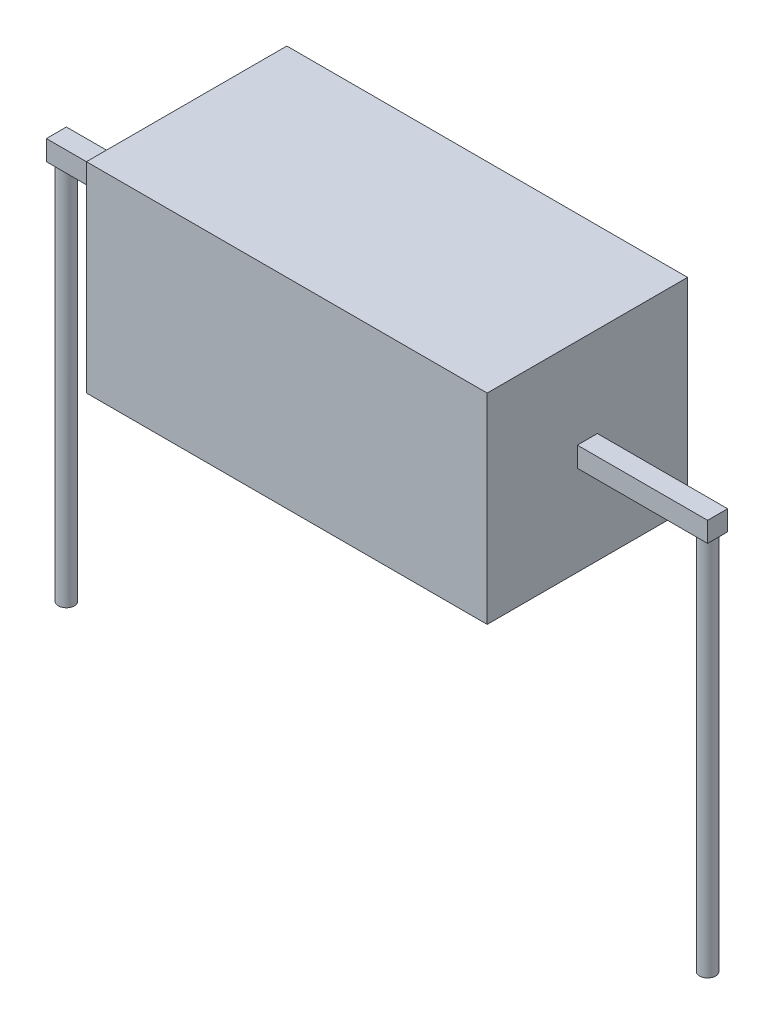
ISO-10303-21;
HEADER;
FILE_DESCRIPTION(('STEP AP214'),'2;1');
FILE_NAME('part.step','',(''),(''),'','','');
FILE_SCHEMA(('AUTOMOTIVE_DESIGN { 1 0 10303 214 1 1 1 1 }'));
ENDSEC;
DATA;
#1=APPLICATION_CONTEXT('core data for automotive mechanical design processes');
#2=APPLICATION_PROTOCOL_DEFINITION('international standard','automotive_design',2000,#1);
#3=PRODUCT_CONTEXT('',#1,'mechanical');
#4=PRODUCT('Part','Part','',(#3));
#5=PRODUCT_RELATED_PRODUCT_CATEGORY('part','',(#4));
#6=PRODUCT_DEFINITION_FORMATION('','',#4);
#7=PRODUCT_DEFINITION_CONTEXT('part definition',#1,'design');
#8=PRODUCT_DEFINITION('design','',#6,#7);
#9=PRODUCT_DEFINITION_SHAPE('','',#8);
#10=(LENGTH_UNIT() NAMED_UNIT(*) SI_UNIT(.MILLI.,.METRE.));
#11=(NAMED_UNIT(*) PLANE_ANGLE_UNIT() SI_UNIT($,.RADIAN.));
#12=(NAMED_UNIT(*) SI_UNIT($,.STERADIAN.) SOLID_ANGLE_UNIT());
#13=UNCERTAINTY_MEASURE_WITH_UNIT(LENGTH_MEASURE(1.E-05),#10,'distance_accuracy_value','');
#14=(GEOMETRIC_REPRESENTATION_CONTEXT(3) GLOBAL_UNCERTAINTY_ASSIGNED_CONTEXT((#13)) GLOBAL_UNIT_ASSIGNED_CONTEXT((#10,
#11,#12)) REPRESENTATION_CONTEXT('',''));
#15=CARTESIAN_POINT('',(0.,0.,0.));
#16=DIRECTION('',(0.,0.,1.));
#17=DIRECTION('',(1.,0.,0.));
#18=AXIS2_PLACEMENT_3D('',#15,#16,#17);
#19=CARTESIAN_POINT('',(26.5,4.5,5.5));
#20=DIRECTION('',(0.,1.,0.));
#21=DIRECTION('',(0.,0.,1.));
#22=AXIS2_PLACEMENT_3D('',#19,#20,#21);
#23=PLANE('',#22);
#24=DIRECTION('',(-1.,0.,0.));
#25=VECTOR('',#24,1.);
#26=CARTESIAN_POINT('',(26.5,4.5,5.5));
#27=LINE('',#26,#25);
#28=CARTESIAN_POINT('',(26.5,4.5,5.5));
#29=VERTEX_POINT('',#28);
#30=CARTESIAN_POINT('',(20.,4.5,5.5));
#31=VERTEX_POINT('',#30);
#32=EDGE_CURVE('E126',#29,#31,#27,.T.);
#33=ORIENTED_EDGE('',*,*,#32,.T.);
#34=DIRECTION('',(0.,0.,-1.));
#35=VECTOR('',#34,1.);
#36=CARTESIAN_POINT('',(20.,4.5,10.));
#37=LINE('',#36,#35);
#38=CARTESIAN_POINT('',(20.,4.5,4.5));
#39=VERTEX_POINT('',#38);
#40=EDGE_CURVE('E215',#31,#39,#37,.T.);
#41=ORIENTED_EDGE('',*,*,#40,.T.);
#42=DIRECTION('',(-1.,0.,0.));
#43=VECTOR('',#42,1.);
#44=CARTESIAN_POINT('',(26.5,4.5,4.5));
#45=LINE('',#44,#43);
#46=CARTESIAN_POINT('',(26.5,4.5,4.5));
#47=VERTEX_POINT('',#46);
#48=EDGE_CURVE('E127',#47,#39,#45,.T.);
#49=ORIENTED_EDGE('',*,*,#48,.F.);
#50=DIRECTION('',(0.,0.,-1.));
#51=VECTOR('',#50,1.);
#52=CARTESIAN_POINT('',(26.5,4.5,5.5));
#53=LINE('',#52,#51);
#54=EDGE_CURVE('E155',#29,#47,#53,.T.);
#55=ORIENTED_EDGE('',*,*,#54,.F.);
#56=EDGE_LOOP('',(#33,#41,#49,#55));
#57=FACE_BOUND('',#56,.T.);
#58=CARTESIAN_POINT('',(26.,4.5,5.));
#59=DIRECTION('',(0.,1.,0.));
#60=DIRECTION('',(0.,0.,1.));
#61=AXIS2_PLACEMENT_3D('',#58,#59,#60);
#62=CIRCLE('',#61,0.400000000000001);
#63=CARTESIAN_POINT('',(26.,4.5,5.40000000000001));
#64=VERTEX_POINT('',#63);
#65=EDGE_CURVE('E11',#64,#64,#62,.F.);
#66=ORIENTED_EDGE('',*,*,#65,.F.);
#67=EDGE_LOOP('',(#66));
#68=FACE_BOUND('',#67,.T.);
#69=ADVANCED_FACE('F31',(#57,#68),#23,.F.);
#70=CARTESIAN_POINT('',(0.,4.5,4.5));
#71=VERTEX_POINT('',#70);
#72=CARTESIAN_POINT('',(-6.5,4.5,4.5));
#73=VERTEX_POINT('',#72);
#74=EDGE_CURVE('E168',#71,#73,#45,.T.);
#75=ORIENTED_EDGE('',*,*,#74,.F.);
#76=DIRECTION('',(0.,0.,1.));
#77=VECTOR('',#76,1.);
#78=CARTESIAN_POINT('',(0.,4.5,10.));
#79=LINE('',#78,#77);
#80=CARTESIAN_POINT('',(0.,4.5,5.5));
#81=VERTEX_POINT('',#80);
#82=EDGE_CURVE('E50',#71,#81,#79,.T.);
#83=ORIENTED_EDGE('',*,*,#82,.T.);
#84=CARTESIAN_POINT('',(-6.5,4.5,5.5));
#85=VERTEX_POINT('',#84);
#86=EDGE_CURVE('E118',#81,#85,#27,.T.);
#87=ORIENTED_EDGE('',*,*,#86,.T.);
#88=DIRECTION('',(0.,0.,-1.));
#89=VECTOR('',#88,1.);
#90=CARTESIAN_POINT('',(-6.5,4.5,5.5));
#91=LINE('',#90,#89);
#92=EDGE_CURVE('E123',#85,#73,#91,.T.);
#93=ORIENTED_EDGE('',*,*,#92,.T.);
#94=EDGE_LOOP('',(#75,#83,#87,#93));
#95=FACE_BOUND('',#94,.T.);
#96=CARTESIAN_POINT('',(-6.,4.5,5.));
#97=DIRECTION('',(0.,1.,0.));
#98=DIRECTION('',(0.,0.,1.));
#99=AXIS2_PLACEMENT_3D('',#96,#97,#98);
#100=CIRCLE('',#99,0.4);
#101=CARTESIAN_POINT('',(-6.,4.5,5.4));
#102=VERTEX_POINT('',#101);
#103=EDGE_CURVE('E39',#102,#102,#100,.F.);
#104=ORIENTED_EDGE('',*,*,#103,.F.);
#105=EDGE_LOOP('',(#104));
#106=FACE_BOUND('',#105,.T.);
#107=ADVANCED_FACE('F121',(#95,#106),#23,.F.);
#108=CARTESIAN_POINT('',(0.,0.,10.));
#109=DIRECTION('',(1.,0.,0.));
#110=DIRECTION('',(0.,0.,-1.));
#111=AXIS2_PLACEMENT_3D('',#108,#109,#110);
#112=PLANE('',#111);
#113=DIRECTION('',(0.,-1.,0.));
#114=VECTOR('',#113,1.);
#115=CARTESIAN_POINT('',(0.,0.,0.));
#116=LINE('',#115,#114);
#117=CARTESIAN_POINT('',(0.,10.,0.));
#118=VERTEX_POINT('',#117);
#119=CARTESIAN_POINT('',(0.,0.,0.));
#120=VERTEX_POINT('',#119);
#121=EDGE_CURVE('E179',#118,#120,#116,.T.);
#122=ORIENTED_EDGE('',*,*,#121,.T.);
#123=DIRECTION('',(0.,0.,-1.));
#124=VECTOR('',#123,1.);
#125=CARTESIAN_POINT('',(0.,0.,10.));
#126=LINE('',#125,#124);
#127=CARTESIAN_POINT('',(0.,0.,10.));
#128=VERTEX_POINT('',#127);
#129=EDGE_CURVE('E206',#128,#120,#126,.T.);
#130=ORIENTED_EDGE('',*,*,#129,.F.);
#131=DIRECTION('',(0.,-1.,0.));
#132=VECTOR('',#131,1.);
#133=CARTESIAN_POINT('',(0.,0.,10.));
#134=LINE('',#133,#132);
#135=CARTESIAN_POINT('',(0.,10.,10.));
#136=VERTEX_POINT('',#135);
#137=EDGE_CURVE('E180',#136,#128,#134,.T.);
#138=ORIENTED_EDGE('',*,*,#137,.F.);
#139=DIRECTION('',(0.,0.,-1.));
#140=VECTOR('',#139,1.);
#141=CARTESIAN_POINT('',(0.,10.,10.));
#142=LINE('',#141,#140);
#143=EDGE_CURVE('E190',#136,#118,#142,.T.);
#144=ORIENTED_EDGE('',*,*,#143,.T.);
#145=EDGE_LOOP('',(#122,#130,#138,#144));
#146=FACE_BOUND('',#145,.T.);
#147=DIRECTION('',(0.,1.,0.));
#148=VECTOR('',#147,1.);
#149=CARTESIAN_POINT('',(0.,0.,5.5));
#150=LINE('',#149,#148);
#151=CARTESIAN_POINT('',(0.,5.5,5.5));
#152=VERTEX_POINT('',#151);
#153=EDGE_CURVE('E46',#81,#152,#150,.T.);
#154=ORIENTED_EDGE('',*,*,#153,.F.);
#155=ORIENTED_EDGE('',*,*,#82,.F.);
#156=DIRECTION('',(0.,-1.,0.));
#157=VECTOR('',#156,1.);
#158=CARTESIAN_POINT('',(0.,0.,4.5));
#159=LINE('',#158,#157);
#160=CARTESIAN_POINT('',(0.,5.5,4.5));
#161=VERTEX_POINT('',#160);
#162=EDGE_CURVE('E175',#161,#71,#159,.T.);
#163=ORIENTED_EDGE('',*,*,#162,.F.);
#164=DIRECTION('',(0.,0.,-1.));
#165=VECTOR('',#164,1.);
#166=CARTESIAN_POINT('',(0.,5.5,10.));
#167=LINE('',#166,#165);
#168=EDGE_CURVE('E172',#152,#161,#167,.T.);
#169=ORIENTED_EDGE('',*,*,#168,.F.);
#170=EDGE_LOOP('',(#154,#155,#163,#169));
#171=FACE_BOUND('',#170,.T.);
#172=ADVANCED_FACE('F33',(#146,#171),#112,.F.);
#173=CARTESIAN_POINT('',(20.,0.,10.));
#174=DIRECTION('',(-1.,0.,0.));
#175=DIRECTION('',(0.,0.,1.));
#176=AXIS2_PLACEMENT_3D('',#173,#174,#175);
#177=PLANE('',#176);
#178=DIRECTION('',(0.,1.,0.));
#179=VECTOR('',#178,1.);
#180=CARTESIAN_POINT('',(20.,0.,0.));
#181=LINE('',#180,#179);
#182=CARTESIAN_POINT('',(20.,0.,0.));
#183=VERTEX_POINT('',#182);
#184=CARTESIAN_POINT('',(20.,10.,0.));
#185=VERTEX_POINT('',#184);
#186=EDGE_CURVE('E195',#183,#185,#181,.T.);
#187=ORIENTED_EDGE('',*,*,#186,.T.);
#188=DIRECTION('',(0.,0.,-1.));
#189=VECTOR('',#188,1.);
#190=CARTESIAN_POINT('',(20.,10.,10.));
#191=LINE('',#190,#189);
#192=CARTESIAN_POINT('',(20.,10.,10.));
#193=VERTEX_POINT('',#192);
#194=EDGE_CURVE('E200',#193,#185,#191,.T.);
#195=ORIENTED_EDGE('',*,*,#194,.F.);
#196=DIRECTION('',(0.,1.,0.));
#197=VECTOR('',#196,1.);
#198=CARTESIAN_POINT('',(20.,0.,10.));
#199=LINE('',#198,#197);
#200=CARTESIAN_POINT('',(20.,0.,10.));
#201=VERTEX_POINT('',#200);
#202=EDGE_CURVE('E186',#201,#193,#199,.T.);
#203=ORIENTED_EDGE('',*,*,#202,.F.);
#204=DIRECTION('',(0.,0.,-1.));
#205=VECTOR('',#204,1.);
#206=CARTESIAN_POINT('',(20.,0.,10.));
#207=LINE('',#206,#205);
#208=EDGE_CURVE('E203',#201,#183,#207,.T.);
#209=ORIENTED_EDGE('',*,*,#208,.T.);
#210=EDGE_LOOP('',(#187,#195,#203,#209));
#211=FACE_BOUND('',#210,.T.);
#212=DIRECTION('',(0.,-1.,0.));
#213=VECTOR('',#212,1.);
#214=CARTESIAN_POINT('',(20.,0.,5.5));
#215=LINE('',#214,#213);
#216=CARTESIAN_POINT('',(20.,5.5,5.5));
#217=VERTEX_POINT('',#216);
#218=EDGE_CURVE('E218',#217,#31,#215,.T.);
#219=ORIENTED_EDGE('',*,*,#218,.F.);
#220=DIRECTION('',(0.,0.,1.));
#221=VECTOR('',#220,1.);
#222=CARTESIAN_POINT('',(20.,5.5,10.));
#223=LINE('',#222,#221);
#224=CARTESIAN_POINT('',(20.,5.5,4.5));
#225=VERTEX_POINT('',#224);
#226=EDGE_CURVE('E209',#225,#217,#223,.T.);
#227=ORIENTED_EDGE('',*,*,#226,.F.);
#228=DIRECTION('',(0.,1.,0.));
#229=VECTOR('',#228,1.);
#230=CARTESIAN_POINT('',(20.,0.,4.5));
#231=LINE('',#230,#229);
#232=EDGE_CURVE('E212',#39,#225,#231,.T.);
#233=ORIENTED_EDGE('',*,*,#232,.F.);
#234=ORIENTED_EDGE('',*,*,#40,.F.);
#235=EDGE_LOOP('',(#219,#227,#233,#234));
#236=FACE_BOUND('',#235,.T.);
#237=ADVANCED_FACE('F230',(#211,#236),#177,.F.);
#238=CARTESIAN_POINT('',(0.,0.,10.));
#239=DIRECTION('',(0.,1.,0.));
#240=DIRECTION('',(0.,0.,1.));
#241=AXIS2_PLACEMENT_3D('',#238,#239,#240);
#242=PLANE('',#241);
#243=DIRECTION('',(1.,0.,0.));
#244=VECTOR('',#243,1.);
#245=CARTESIAN_POINT('',(0.,0.,0.));
#246=LINE('',#245,#244);
#247=EDGE_CURVE('E193',#120,#183,#246,.T.);
#248=ORIENTED_EDGE('',*,*,#247,.T.);
#249=ORIENTED_EDGE('',*,*,#208,.F.);
#250=DIRECTION('',(1.,0.,0.));
#251=VECTOR('',#250,1.);
#252=CARTESIAN_POINT('',(0.,0.,10.));
#253=LINE('',#252,#251);
#254=EDGE_CURVE('E183',#128,#201,#253,.T.);
#255=ORIENTED_EDGE('',*,*,#254,.F.);
#256=ORIENTED_EDGE('',*,*,#129,.T.);
#257=EDGE_LOOP('',(#248,#249,#255,#256));
#258=FACE_BOUND('',#257,.T.);
#259=ADVANCED_FACE('F252',(#258),#242,.F.);
#260=CARTESIAN_POINT('',(0.,10.,10.));
#261=DIRECTION('',(0.,-1.,0.));
#262=DIRECTION('',(0.,0.,-1.));
#263=AXIS2_PLACEMENT_3D('',#260,#261,#262);
#264=PLANE('',#263);
#265=DIRECTION('',(-1.,0.,0.));
#266=VECTOR('',#265,1.);
#267=CARTESIAN_POINT('',(0.,10.,0.));
#268=LINE('',#267,#266);
#269=EDGE_CURVE('E184',#185,#118,#268,.T.);
#270=ORIENTED_EDGE('',*,*,#269,.T.);
#271=ORIENTED_EDGE('',*,*,#143,.F.);
#272=DIRECTION('',(-1.,0.,0.));
#273=VECTOR('',#272,1.);
#274=CARTESIAN_POINT('',(0.,10.,10.));
#275=LINE('',#274,#273);
#276=EDGE_CURVE('E188',#193,#136,#275,.T.);
#277=ORIENTED_EDGE('',*,*,#276,.F.);
#278=ORIENTED_EDGE('',*,*,#194,.T.);
#279=EDGE_LOOP('',(#270,#271,#277,#278));
#280=FACE_BOUND('',#279,.T.);
#281=ADVANCED_FACE('F244',(#280),#264,.F.);
#282=CARTESIAN_POINT('',(0.,10.,10.));
#283=DIRECTION('',(0.,0.,-1.));
#284=DIRECTION('',(-1.,0.,0.));
#285=AXIS2_PLACEMENT_3D('',#282,#283,#284);
#286=PLANE('',#285);
#287=ORIENTED_EDGE('',*,*,#137,.T.);
#288=ORIENTED_EDGE('',*,*,#254,.T.);
#289=ORIENTED_EDGE('',*,*,#202,.T.);
#290=ORIENTED_EDGE('',*,*,#276,.T.);
#291=EDGE_LOOP('',(#287,#288,#289,#290));
#292=FACE_BOUND('',#291,.T.);
#293=ADVANCED_FACE('F240',(#292),#286,.F.);
#294=CARTESIAN_POINT('',(0.,10.,0.));
#295=DIRECTION('',(0.,0.,-1.));
#296=DIRECTION('',(-1.,0.,0.));
#297=AXIS2_PLACEMENT_3D('',#294,#295,#296);
#298=PLANE('',#297);
#299=ORIENTED_EDGE('',*,*,#121,.F.);
#300=ORIENTED_EDGE('',*,*,#269,.F.);
#301=ORIENTED_EDGE('',*,*,#186,.F.);
#302=ORIENTED_EDGE('',*,*,#247,.F.);
#303=EDGE_LOOP('',(#299,#300,#301,#302));
#304=FACE_BOUND('',#303,.T.);
#305=ADVANCED_FACE('F243',(#304),#298,.T.);
#306=CARTESIAN_POINT('',(26.5,5.5,5.5));
#307=DIRECTION('',(-1.,0.,0.));
#308=DIRECTION('',(0.,0.,1.));
#309=AXIS2_PLACEMENT_3D('',#306,#307,#308);
#310=PLANE('',#309);
#311=DIRECTION('',(0.,-1.,0.));
#312=VECTOR('',#311,1.);
#313=CARTESIAN_POINT('',(26.5,4.5,5.5));
#314=LINE('',#313,#312);
#315=CARTESIAN_POINT('',(26.5,5.5,5.5));
#316=VERTEX_POINT('',#315);
#317=EDGE_CURVE('E152',#316,#29,#314,.T.);
#318=ORIENTED_EDGE('',*,*,#317,.T.);
#319=ORIENTED_EDGE('',*,*,#54,.T.);
#320=DIRECTION('',(0.,1.,0.));
#321=VECTOR('',#320,1.);
#322=CARTESIAN_POINT('',(26.5,4.5,4.5));
#323=LINE('',#322,#321);
#324=CARTESIAN_POINT('',(26.5,5.5,4.5));
#325=VERTEX_POINT('',#324);
#326=EDGE_CURVE('E157',#47,#325,#323,.T.);
#327=ORIENTED_EDGE('',*,*,#326,.T.);
#328=DIRECTION('',(0.,0.,1.));
#329=VECTOR('',#328,1.);
#330=CARTESIAN_POINT('',(26.5,5.5,5.5));
#331=LINE('',#330,#329);
#332=EDGE_CURVE('E159',#325,#316,#331,.T.);
#333=ORIENTED_EDGE('',*,*,#332,.T.);
#334=EDGE_LOOP('',(#318,#319,#327,#333));
#335=FACE_BOUND('',#334,.T.);
#336=ADVANCED_FACE('F248',(#335),#310,.F.);
#337=CARTESIAN_POINT('',(26.5,5.5,5.5));
#338=DIRECTION('',(0.,-1.,0.));
#339=DIRECTION('',(0.,0.,-1.));
#340=AXIS2_PLACEMENT_3D('',#337,#338,#339);
#341=PLANE('',#340);
#342=DIRECTION('',(-1.,0.,0.));
#343=VECTOR('',#342,1.);
#344=CARTESIAN_POINT('',(26.5,5.5,4.5));
#345=LINE('',#344,#343);
#346=EDGE_CURVE('E165',#325,#225,#345,.T.);
#347=ORIENTED_EDGE('',*,*,#346,.T.);
#348=ORIENTED_EDGE('',*,*,#226,.T.);
#349=DIRECTION('',(-1.,0.,0.));
#350=VECTOR('',#349,1.);
#351=CARTESIAN_POINT('',(26.5,5.5,5.5));
#352=LINE('',#351,#350);
#353=EDGE_CURVE('E161',#316,#217,#352,.T.);
#354=ORIENTED_EDGE('',*,*,#353,.F.);
#355=ORIENTED_EDGE('',*,*,#332,.F.);
#356=EDGE_LOOP('',(#347,#348,#354,#355));
#357=FACE_BOUND('',#356,.T.);
#358=ADVANCED_FACE('F275',(#357),#341,.F.);
#359=CARTESIAN_POINT('',(26.5,4.5,4.5));
#360=DIRECTION('',(0.,0.,1.));
#361=DIRECTION('',(1.,0.,0.));
#362=AXIS2_PLACEMENT_3D('',#359,#360,#361);
#363=PLANE('',#362);
#364=ORIENTED_EDGE('',*,*,#48,.T.);
#365=ORIENTED_EDGE('',*,*,#232,.T.);
#366=ORIENTED_EDGE('',*,*,#346,.F.);
#367=ORIENTED_EDGE('',*,*,#326,.F.);
#368=EDGE_LOOP('',(#364,#365,#366,#367));
#369=FACE_BOUND('',#368,.T.);
#370=ADVANCED_FACE('F283',(#369),#363,.F.);
#371=CARTESIAN_POINT('',(26.5,4.5,5.5));
#372=DIRECTION('',(0.,0.,-1.));
#373=DIRECTION('',(-1.,0.,0.));
#374=AXIS2_PLACEMENT_3D('',#371,#372,#373);
#375=PLANE('',#374);
#376=ORIENTED_EDGE('',*,*,#353,.T.);
#377=ORIENTED_EDGE('',*,*,#218,.T.);
#378=ORIENTED_EDGE('',*,*,#32,.F.);
#379=ORIENTED_EDGE('',*,*,#317,.F.);
#380=EDGE_LOOP('',(#376,#377,#378,#379));
#381=FACE_BOUND('',#380,.T.);
#382=ADVANCED_FACE('F239',(#381),#375,.F.);
#383=ORIENTED_EDGE('',*,*,#86,.F.);
#384=ORIENTED_EDGE('',*,*,#153,.T.);
#385=CARTESIAN_POINT('',(-6.5,5.5,5.5));
#386=VERTEX_POINT('',#385);
#387=EDGE_CURVE('E141',#152,#386,#352,.T.);
#388=ORIENTED_EDGE('',*,*,#387,.T.);
#389=DIRECTION('',(0.,-1.,0.));
#390=VECTOR('',#389,1.);
#391=CARTESIAN_POINT('',(-6.5,4.5,5.5));
#392=LINE('',#391,#390);
#393=EDGE_CURVE('E134',#386,#85,#392,.T.);
#394=ORIENTED_EDGE('',*,*,#393,.T.);
#395=EDGE_LOOP('',(#383,#384,#388,#394));
#396=FACE_BOUND('',#395,.T.);
#397=ADVANCED_FACE('F139',(#396),#375,.F.);
#398=CARTESIAN_POINT('',(-6.5,5.5,4.5));
#399=VERTEX_POINT('',#398);
#400=EDGE_CURVE('E164',#161,#399,#345,.T.);
#401=ORIENTED_EDGE('',*,*,#400,.F.);
#402=ORIENTED_EDGE('',*,*,#162,.T.);
#403=ORIENTED_EDGE('',*,*,#74,.T.);
#404=DIRECTION('',(0.,1.,0.));
#405=VECTOR('',#404,1.);
#406=CARTESIAN_POINT('',(-6.5,4.5,4.5));
#407=LINE('',#406,#405);
#408=EDGE_CURVE('E137',#73,#399,#407,.T.);
#409=ORIENTED_EDGE('',*,*,#408,.T.);
#410=EDGE_LOOP('',(#401,#402,#403,#409));
#411=FACE_BOUND('',#410,.T.);
#412=ADVANCED_FACE('F235',(#411),#363,.F.);
#413=ORIENTED_EDGE('',*,*,#387,.F.);
#414=ORIENTED_EDGE('',*,*,#168,.T.);
#415=ORIENTED_EDGE('',*,*,#400,.T.);
#416=DIRECTION('',(0.,0.,1.));
#417=VECTOR('',#416,1.);
#418=CARTESIAN_POINT('',(-6.5,5.5,5.5));
#419=LINE('',#418,#417);
#420=EDGE_CURVE('E150',#399,#386,#419,.T.);
#421=ORIENTED_EDGE('',*,*,#420,.T.);
#422=EDGE_LOOP('',(#413,#414,#415,#421));
#423=FACE_BOUND('',#422,.T.);
#424=ADVANCED_FACE('F308',(#423),#341,.F.);
#425=CARTESIAN_POINT('',(-6.5,5.5,5.5));
#426=DIRECTION('',(-1.,0.,0.));
#427=DIRECTION('',(0.,0.,1.));
#428=AXIS2_PLACEMENT_3D('',#425,#426,#427);
#429=PLANE('',#428);
#430=ORIENTED_EDGE('',*,*,#393,.F.);
#431=ORIENTED_EDGE('',*,*,#420,.F.);
#432=ORIENTED_EDGE('',*,*,#408,.F.);
#433=ORIENTED_EDGE('',*,*,#92,.F.);
#434=EDGE_LOOP('',(#430,#431,#432,#433));
#435=FACE_BOUND('',#434,.T.);
#436=ADVANCED_FACE('F132',(#435),#429,.T.);
#437=CARTESIAN_POINT('',(-6.,-14.5,5.));
#438=DIRECTION('',(0.,1.,0.));
#439=DIRECTION('',(0.,0.,1.));
#440=AXIS2_PLACEMENT_3D('',#437,#438,#439);
#441=CYLINDRICAL_SURFACE('',#440,0.4);
#442=CARTESIAN_POINT('',(-6.,-14.5,5.));
#443=DIRECTION('',(0.,-1.,0.));
#444=DIRECTION('',(0.,0.,-1.));
#445=AXIS2_PLACEMENT_3D('',#442,#443,#444);
#446=CIRCLE('',#445,0.4);
#447=CARTESIAN_POINT('',(-6.,-14.5,4.6));
#448=VERTEX_POINT('',#447);
#449=EDGE_CURVE('E142',#448,#448,#446,.T.);
#450=ORIENTED_EDGE('',*,*,#449,.F.);
#451=EDGE_LOOP('',(#450));
#452=FACE_BOUND('',#451,.T.);
#453=ORIENTED_EDGE('',*,*,#103,.T.);
#454=EDGE_LOOP('',(#453));
#455=FACE_BOUND('',#454,.T.);
#456=ADVANCED_FACE('F223',(#452,#455),#441,.T.);
#457=CARTESIAN_POINT('',(-6.,-14.5,5.));
#458=DIRECTION('',(0.,-1.,0.));
#459=DIRECTION('',(0.,0.,-1.));
#460=AXIS2_PLACEMENT_3D('',#457,#458,#459);
#461=PLANE('',#460);
#462=ORIENTED_EDGE('',*,*,#449,.T.);
#463=EDGE_LOOP('',(#462));
#464=FACE_BOUND('',#463,.T.);
#465=ADVANCED_FACE('F290',(#464),#461,.T.);
#466=CARTESIAN_POINT('',(26.,-14.5,5.));
#467=DIRECTION('',(0.,1.,0.));
#468=DIRECTION('',(0.,0.,1.));
#469=AXIS2_PLACEMENT_3D('',#466,#467,#468);
#470=CYLINDRICAL_SURFACE('',#469,0.400000000000001);
#471=CARTESIAN_POINT('',(26.,-14.5,5.));
#472=DIRECTION('',(0.,-1.,0.));
#473=DIRECTION('',(0.,0.,-1.));
#474=AXIS2_PLACEMENT_3D('',#471,#472,#473);
#475=CIRCLE('',#474,0.400000000000001);
#476=CARTESIAN_POINT('',(26.,-14.5,4.6));
#477=VERTEX_POINT('',#476);
#478=EDGE_CURVE('E145',#477,#477,#475,.T.);
#479=ORIENTED_EDGE('',*,*,#478,.F.);
#480=EDGE_LOOP('',(#479));
#481=FACE_BOUND('',#480,.T.);
#482=ORIENTED_EDGE('',*,*,#65,.T.);
#483=EDGE_LOOP('',(#482));
#484=FACE_BOUND('',#483,.T.);
#485=ADVANCED_FACE('F287',(#481,#484),#470,.T.);
#486=CARTESIAN_POINT('',(26.,-14.5,5.));
#487=DIRECTION('',(0.,-1.,0.));
#488=DIRECTION('',(0.,0.,-1.));
#489=AXIS2_PLACEMENT_3D('',#486,#487,#488);
#490=PLANE('',#489);
#491=ORIENTED_EDGE('',*,*,#478,.T.);
#492=EDGE_LOOP('',(#491));
#493=FACE_BOUND('',#492,.T.);
#494=ADVANCED_FACE('F289',(#493),#490,.T.);
#495=CLOSED_SHELL('',(#69,#107,#172,#237,#259,#281,#293,#305,#336,#358,#370,#382,#397,#412,#424,
#436,#456,#465,#485,#494));
#496=MANIFOLD_SOLID_BREP('B2',#495);
#497=ADVANCED_BREP_SHAPE_REPRESENTATION('',(#18,#496),#14);
#498=SHAPE_DEFINITION_REPRESENTATION(#9,#497);
ENDSEC;
END-ISO-10303-21;
